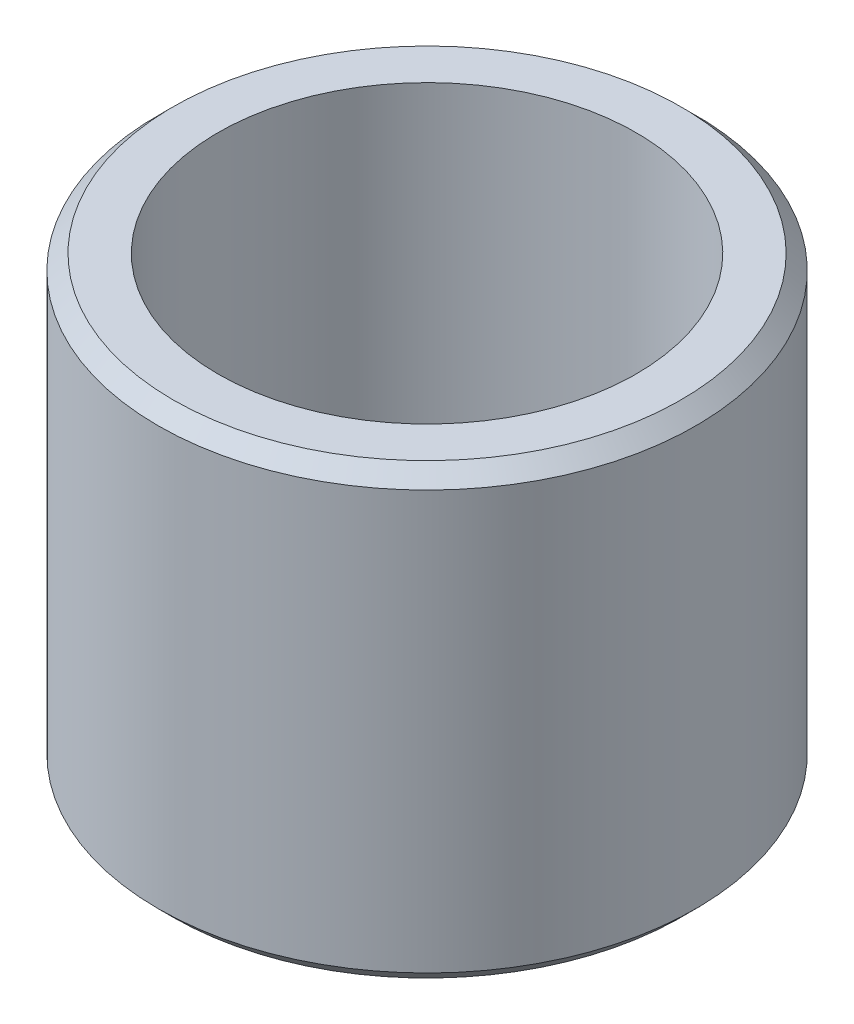
ISO-10303-21;
HEADER;
FILE_DESCRIPTION(('STEP AP214'),'2;1');
FILE_NAME('part.step','',(''),(''),'','','');
FILE_SCHEMA(('AUTOMOTIVE_DESIGN { 1 0 10303 214 1 1 1 1 }'));
ENDSEC;
DATA;
#1=APPLICATION_CONTEXT('core data for automotive mechanical design processes');
#2=APPLICATION_PROTOCOL_DEFINITION('international standard','automotive_design',2000,#1);
#3=PRODUCT_CONTEXT('',#1,'mechanical');
#4=PRODUCT('Part','Part','',(#3));
#5=PRODUCT_RELATED_PRODUCT_CATEGORY('part','',(#4));
#6=PRODUCT_DEFINITION_FORMATION('','',#4);
#7=PRODUCT_DEFINITION_CONTEXT('part definition',#1,'design');
#8=PRODUCT_DEFINITION('design','',#6,#7);
#9=PRODUCT_DEFINITION_SHAPE('','',#8);
#10=(LENGTH_UNIT() NAMED_UNIT(*) SI_UNIT(.MILLI.,.METRE.));
#11=(NAMED_UNIT(*) PLANE_ANGLE_UNIT() SI_UNIT($,.RADIAN.));
#12=(NAMED_UNIT(*) SI_UNIT($,.STERADIAN.) SOLID_ANGLE_UNIT());
#13=UNCERTAINTY_MEASURE_WITH_UNIT(LENGTH_MEASURE(1.E-05),#10,'distance_accuracy_value','');
#14=(GEOMETRIC_REPRESENTATION_CONTEXT(3) GLOBAL_UNCERTAINTY_ASSIGNED_CONTEXT((#13)) GLOBAL_UNIT_ASSIGNED_CONTEXT((#10,
#11,#12)) REPRESENTATION_CONTEXT('',''));
#15=CARTESIAN_POINT('',(0.,0.,0.));
#16=DIRECTION('',(0.,0.,1.));
#17=DIRECTION('',(1.,0.,0.));
#18=AXIS2_PLACEMENT_3D('',#15,#16,#17);
#19=CARTESIAN_POINT('',(0.,15.,0.));
#20=DIRECTION('',(0.,1.,0.));
#21=DIRECTION('',(0.,0.,1.));
#22=AXIS2_PLACEMENT_3D('',#19,#20,#21);
#23=PLANE('',#22);
#24=CARTESIAN_POINT('',(0.,15.,0.));
#25=DIRECTION('',(0.,1.,0.));
#26=DIRECTION('',(0.,0.,1.));
#27=AXIS2_PLACEMENT_3D('',#24,#25,#26);
#28=CIRCLE('',#27,8.5);
#29=CARTESIAN_POINT('',(0.,15.,8.5));
#30=VERTEX_POINT('',#29);
#31=EDGE_CURVE('E10',#30,#30,#28,.T.);
#32=ORIENTED_EDGE('',*,*,#31,.T.);
#33=EDGE_LOOP('',(#32));
#34=FACE_BOUND('',#33,.T.);
#35=CARTESIAN_POINT('',(0.,15.,0.));
#36=DIRECTION('',(0.,1.,0.));
#37=DIRECTION('',(0.,0.,1.));
#38=AXIS2_PLACEMENT_3D('',#35,#36,#37);
#39=CIRCLE('',#38,7.);
#40=CARTESIAN_POINT('',(0.,15.,7.));
#41=VERTEX_POINT('',#40);
#42=EDGE_CURVE('E50',#41,#41,#39,.T.);
#43=ORIENTED_EDGE('',*,*,#42,.F.);
#44=EDGE_LOOP('',(#43));
#45=FACE_BOUND('',#44,.T.);
#46=ADVANCED_FACE('F30',(#34,#45),#23,.T.);
#47=CARTESIAN_POINT('',(0.,0.,0.));
#48=DIRECTION('',(0.,1.,0.));
#49=DIRECTION('',(0.,0.,1.));
#50=AXIS2_PLACEMENT_3D('',#47,#48,#49);
#51=PLANE('',#50);
#52=CARTESIAN_POINT('',(0.,0.,0.));
#53=DIRECTION('',(0.,1.,0.));
#54=DIRECTION('',(0.,0.,1.));
#55=AXIS2_PLACEMENT_3D('',#52,#53,#54);
#56=CIRCLE('',#55,8.5);
#57=CARTESIAN_POINT('',(0.,0.,8.5));
#58=VERTEX_POINT('',#57);
#59=EDGE_CURVE('E37',#58,#58,#56,.F.);
#60=ORIENTED_EDGE('',*,*,#59,.T.);
#61=EDGE_LOOP('',(#60));
#62=FACE_BOUND('',#61,.T.);
#63=CARTESIAN_POINT('',(0.,0.,0.));
#64=DIRECTION('',(0.,1.,0.));
#65=DIRECTION('',(0.,0.,1.));
#66=AXIS2_PLACEMENT_3D('',#63,#64,#65);
#67=CIRCLE('',#66,7.);
#68=CARTESIAN_POINT('',(0.,0.,7.));
#69=VERTEX_POINT('',#68);
#70=EDGE_CURVE('E51',#69,#69,#67,.T.);
#71=ORIENTED_EDGE('',*,*,#70,.T.);
#72=EDGE_LOOP('',(#71));
#73=FACE_BOUND('',#72,.T.);
#74=ADVANCED_FACE('F61',(#62,#73),#51,.F.);
#75=CARTESIAN_POINT('',(0.,15.,0.));
#76=DIRECTION('',(0.,-1.,0.));
#77=DIRECTION('',(0.,0.,-1.));
#78=AXIS2_PLACEMENT_3D('',#75,#76,#77);
#79=CYLINDRICAL_SURFACE('',#78,9.);
#80=CARTESIAN_POINT('',(0.,0.499999999999997,0.));
#81=DIRECTION('',(0.,1.,0.));
#82=DIRECTION('',(0.,0.,1.));
#83=AXIS2_PLACEMENT_3D('',#80,#81,#82);
#84=CIRCLE('',#83,9.);
#85=CARTESIAN_POINT('',(0.,0.499999999999997,9.));
#86=VERTEX_POINT('',#85);
#87=EDGE_CURVE('E41',#86,#86,#84,.T.);
#88=ORIENTED_EDGE('',*,*,#87,.T.);
#89=EDGE_LOOP('',(#88));
#90=FACE_BOUND('',#89,.T.);
#91=CARTESIAN_POINT('',(0.,14.5,0.));
#92=DIRECTION('',(0.,1.,0.));
#93=DIRECTION('',(0.,0.,1.));
#94=AXIS2_PLACEMENT_3D('',#91,#92,#93);
#95=CIRCLE('',#94,9.);
#96=CARTESIAN_POINT('',(0.,14.5,9.));
#97=VERTEX_POINT('',#96);
#98=EDGE_CURVE('E45',#97,#97,#95,.F.);
#99=ORIENTED_EDGE('',*,*,#98,.T.);
#100=EDGE_LOOP('',(#99));
#101=FACE_BOUND('',#100,.T.);
#102=ADVANCED_FACE('F66',(#90,#101),#79,.T.);
#103=CARTESIAN_POINT('',(0.,15.,0.));
#104=DIRECTION('',(0.,-1.,0.));
#105=DIRECTION('',(0.,0.,-1.));
#106=AXIS2_PLACEMENT_3D('',#103,#104,#105);
#107=CYLINDRICAL_SURFACE('',#106,7.);
#108=ORIENTED_EDGE('',*,*,#42,.T.);
#109=EDGE_LOOP('',(#108));
#110=FACE_BOUND('',#109,.T.);
#111=ORIENTED_EDGE('',*,*,#70,.F.);
#112=EDGE_LOOP('',(#111));
#113=FACE_BOUND('',#112,.T.);
#114=ADVANCED_FACE('F57',(#110,#113),#107,.F.);
#115=CARTESIAN_POINT('',(0.,0.499999999999997,0.));
#116=DIRECTION('',(0.,1.,0.));
#117=DIRECTION('',(0.,0.,1.));
#118=AXIS2_PLACEMENT_3D('',#115,#116,#117);
#119=CONICAL_SURFACE('',#118,9.,0.78539816339745);
#120=ORIENTED_EDGE('',*,*,#59,.F.);
#121=EDGE_LOOP('',(#120));
#122=FACE_BOUND('',#121,.T.);
#123=ORIENTED_EDGE('',*,*,#87,.F.);
#124=EDGE_LOOP('',(#123));
#125=FACE_BOUND('',#124,.T.);
#126=ADVANCED_FACE('F72',(#122,#125),#119,.T.);
#127=CARTESIAN_POINT('',(0.,15.,0.));
#128=DIRECTION('',(0.,-1.,0.));
#129=DIRECTION('',(0.,0.,-1.));
#130=AXIS2_PLACEMENT_3D('',#127,#128,#129);
#131=CONICAL_SURFACE('',#130,8.5,0.785398163397445);
#132=ORIENTED_EDGE('',*,*,#98,.F.);
#133=EDGE_LOOP('',(#132));
#134=FACE_BOUND('',#133,.T.);
#135=ORIENTED_EDGE('',*,*,#31,.F.);
#136=EDGE_LOOP('',(#135));
#137=FACE_BOUND('',#136,.T.);
#138=ADVANCED_FACE('F32',(#134,#137),#131,.T.);
#139=CLOSED_SHELL('',(#46,#74,#102,#114,#126,#138));
#140=MANIFOLD_SOLID_BREP('B2',#139);
#141=ADVANCED_BREP_SHAPE_REPRESENTATION('',(#18,#140),#14);
#142=SHAPE_DEFINITION_REPRESENTATION(#9,#141);
ENDSEC;
END-ISO-10303-21;
